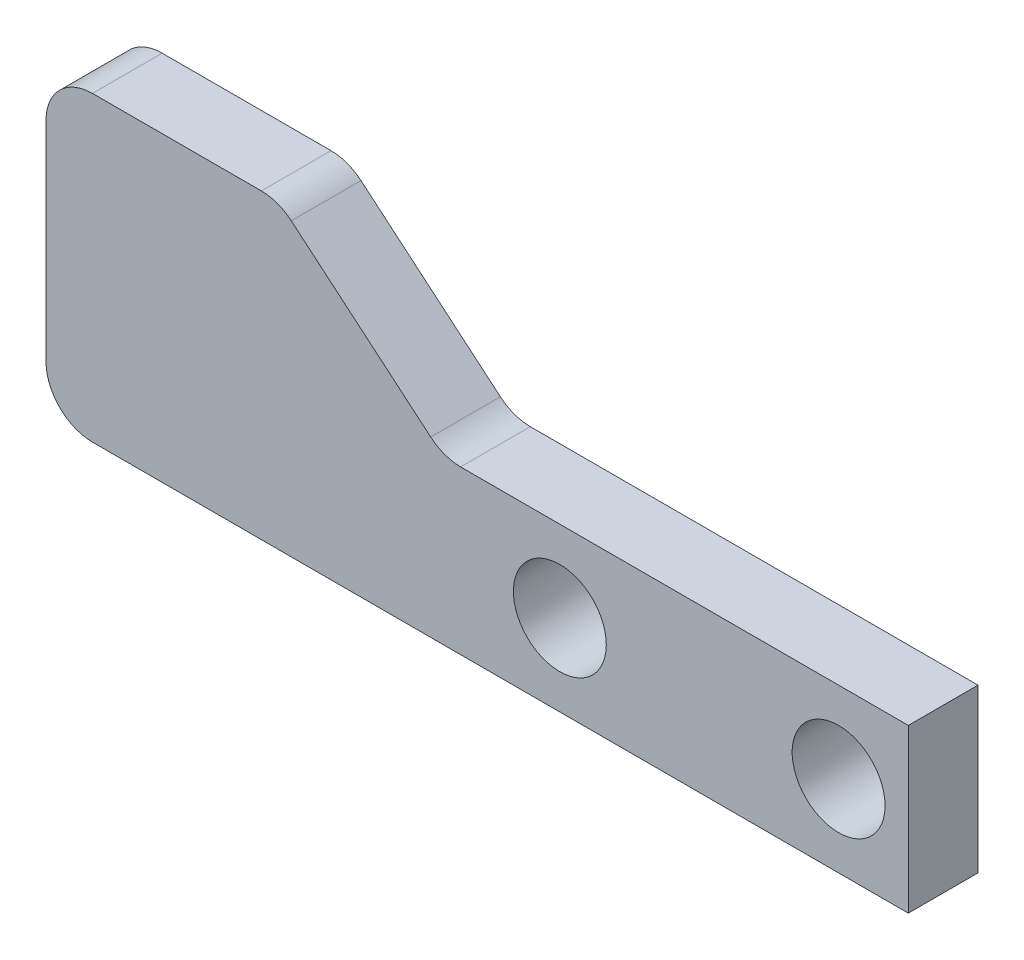
ISO-10303-21;
HEADER;
FILE_DESCRIPTION(('STEP AP214'),'2;1');
FILE_NAME('part.step','',(''),(''),'','','');
FILE_SCHEMA(('AUTOMOTIVE_DESIGN { 1 0 10303 214 1 1 1 1 }'));
ENDSEC;
DATA;
#1=APPLICATION_CONTEXT('core data for automotive mechanical design processes');
#2=APPLICATION_PROTOCOL_DEFINITION('international standard','automotive_design',2000,#1);
#3=PRODUCT_CONTEXT('',#1,'mechanical');
#4=PRODUCT('Part','Part','',(#3));
#5=PRODUCT_RELATED_PRODUCT_CATEGORY('part','',(#4));
#6=PRODUCT_DEFINITION_FORMATION('','',#4);
#7=PRODUCT_DEFINITION_CONTEXT('part definition',#1,'design');
#8=PRODUCT_DEFINITION('design','',#6,#7);
#9=PRODUCT_DEFINITION_SHAPE('','',#8);
#10=(LENGTH_UNIT() NAMED_UNIT(*) SI_UNIT(.MILLI.,.METRE.));
#11=(NAMED_UNIT(*) PLANE_ANGLE_UNIT() SI_UNIT($,.RADIAN.));
#12=(NAMED_UNIT(*) SI_UNIT($,.STERADIAN.) SOLID_ANGLE_UNIT());
#13=UNCERTAINTY_MEASURE_WITH_UNIT(LENGTH_MEASURE(1.E-05),#10,'distance_accuracy_value','');
#14=(GEOMETRIC_REPRESENTATION_CONTEXT(3) GLOBAL_UNCERTAINTY_ASSIGNED_CONTEXT((#13)) GLOBAL_UNIT_ASSIGNED_CONTEXT((#10,
#11,#12)) REPRESENTATION_CONTEXT('',''));
#15=CARTESIAN_POINT('',(0.,0.,0.));
#16=DIRECTION('',(0.,0.,1.));
#17=DIRECTION('',(1.,0.,0.));
#18=AXIS2_PLACEMENT_3D('',#15,#16,#17);
#19=CARTESIAN_POINT('',(-10.2694452488353,5.5,1.5));
#20=DIRECTION('',(0.,0.,-1.));
#21=DIRECTION('',(-1.,0.,0.));
#22=AXIS2_PLACEMENT_3D('',#19,#20,#21);
#23=PLANE('',#22);
#24=CARTESIAN_POINT('',(-6.,0.,1.5));
#25=DIRECTION('',(0.,0.,1.));
#26=DIRECTION('',(1.,0.,0.));
#27=AXIS2_PLACEMENT_3D('',#24,#25,#26);
#28=CIRCLE('',#27,2.);
#29=CARTESIAN_POINT('',(-4.,0.,1.5));
#30=VERTEX_POINT('',#29);
#31=EDGE_CURVE('E147',#30,#30,#28,.T.);
#32=ORIENTED_EDGE('',*,*,#31,.F.);
#33=EDGE_LOOP('',(#32));
#34=FACE_BOUND('',#33,.T.);
#35=DIRECTION('',(0.,1.,0.));
#36=VECTOR('',#35,1.);
#37=CARTESIAN_POINT('',(9.,-3.5,1.5));
#38=LINE('',#37,#36);
#39=CARTESIAN_POINT('',(9.,-3.5,1.5));
#40=VERTEX_POINT('',#39);
#41=CARTESIAN_POINT('',(9.,3.5,1.5));
#42=VERTEX_POINT('',#41);
#43=EDGE_CURVE('E163',#40,#42,#38,.T.);
#44=ORIENTED_EDGE('',*,*,#43,.T.);
#45=DIRECTION('',(-1.,0.,0.));
#46=VECTOR('',#45,1.);
#47=CARTESIAN_POINT('',(-9.,3.5,1.5));
#48=LINE('',#47,#46);
#49=CARTESIAN_POINT('',(-10.2694452488353,3.5,1.5));
#50=VERTEX_POINT('',#49);
#51=EDGE_CURVE('E97',#42,#50,#48,.T.);
#52=ORIENTED_EDGE('',*,*,#51,.T.);
#53=CARTESIAN_POINT('',(-10.2694452488353,5.5,1.5));
#54=DIRECTION('',(0.,0.,-1.));
#55=DIRECTION('',(-1.,0.,0.));
#56=AXIS2_PLACEMENT_3D('',#53,#54,#55);
#57=CIRCLE('',#56,2.);
#58=CARTESIAN_POINT('',(-11.5585523364515,3.97088165380907,1.5));
#59=VERTEX_POINT('',#58);
#60=EDGE_CURVE('E184',#50,#59,#57,.T.);
#61=ORIENTED_EDGE('',*,*,#60,.T.);
#62=DIRECTION('',(-0.764559173095464,0.6445535438081,0.));
#63=VECTOR('',#62,1.);
#64=CARTESIAN_POINT('',(-11.5585523364515,3.97088165380908,1.5));
#65=LINE('',#64,#63);
#66=CARTESIAN_POINT('',(-17.5585523364515,9.02911834619092,1.5));
#67=VERTEX_POINT('',#66);
#68=EDGE_CURVE('E201',#59,#67,#65,.T.);
#69=ORIENTED_EDGE('',*,*,#68,.T.);
#70=CARTESIAN_POINT('',(-18.8476594240677,7.5,1.5));
#71=DIRECTION('',(0.,0.,1.));
#72=DIRECTION('',(-1.,0.,0.));
#73=AXIS2_PLACEMENT_3D('',#70,#71,#72);
#74=CIRCLE('',#73,2.);
#75=CARTESIAN_POINT('',(-18.8476594240677,9.5,1.5));
#76=VERTEX_POINT('',#75);
#77=EDGE_CURVE('E198',#67,#76,#74,.T.);
#78=ORIENTED_EDGE('',*,*,#77,.T.);
#79=DIRECTION('',(-1.,0.,0.));
#80=VECTOR('',#79,1.);
#81=CARTESIAN_POINT('',(-18.8476594240677,9.5,1.5));
#82=LINE('',#81,#80);
#83=CARTESIAN_POINT('',(-26.117104672903,9.5,1.5));
#84=VERTEX_POINT('',#83);
#85=EDGE_CURVE('E200',#76,#84,#82,.T.);
#86=ORIENTED_EDGE('',*,*,#85,.T.);
#87=CARTESIAN_POINT('',(-26.117104672903,7.5,1.5));
#88=DIRECTION('',(0.,0.,1.));
#89=DIRECTION('',(-1.,0.,0.));
#90=AXIS2_PLACEMENT_3D('',#87,#88,#89);
#91=CIRCLE('',#90,2.);
#92=CARTESIAN_POINT('',(-28.117104672903,7.5,1.5));
#93=VERTEX_POINT('',#92);
#94=EDGE_CURVE('E123',#84,#93,#91,.T.);
#95=ORIENTED_EDGE('',*,*,#94,.T.);
#96=DIRECTION('',(0.,-1.,0.));
#97=VECTOR('',#96,1.);
#98=CARTESIAN_POINT('',(-28.117104672903,7.5,1.5));
#99=LINE('',#98,#97);
#100=CARTESIAN_POINT('',(-28.117104672903,-1.5,1.5));
#101=VERTEX_POINT('',#100);
#102=EDGE_CURVE('E116',#93,#101,#99,.T.);
#103=ORIENTED_EDGE('',*,*,#102,.T.);
#104=CARTESIAN_POINT('',(-26.117104672903,-1.5,1.5));
#105=DIRECTION('',(0.,0.,1.));
#106=DIRECTION('',(-1.,0.,0.));
#107=AXIS2_PLACEMENT_3D('',#104,#105,#106);
#108=CIRCLE('',#107,2.);
#109=CARTESIAN_POINT('',(-26.117104672903,-3.5,1.5));
#110=VERTEX_POINT('',#109);
#111=EDGE_CURVE('E120',#101,#110,#108,.T.);
#112=ORIENTED_EDGE('',*,*,#111,.T.);
#113=DIRECTION('',(1.,0.,0.));
#114=VECTOR('',#113,1.);
#115=CARTESIAN_POINT('',(-26.117104672903,-3.5,1.5));
#116=LINE('',#115,#114);
#117=EDGE_CURVE('E50',#110,#40,#116,.T.);
#118=ORIENTED_EDGE('',*,*,#117,.T.);
#119=EDGE_LOOP('',(#44,#52,#61,#69,#78,#86,#95,#103,#112,#118));
#120=FACE_BOUND('',#119,.T.);
#121=CARTESIAN_POINT('',(6.,0.,1.5));
#122=DIRECTION('',(0.,0.,1.));
#123=DIRECTION('',(1.,0.,0.));
#124=AXIS2_PLACEMENT_3D('',#121,#122,#123);
#125=CIRCLE('',#124,2.);
#126=CARTESIAN_POINT('',(8.,0.,1.5));
#127=VERTEX_POINT('',#126);
#128=EDGE_CURVE('E212',#127,#127,#125,.T.);
#129=ORIENTED_EDGE('',*,*,#128,.F.);
#130=EDGE_LOOP('',(#129));
#131=FACE_BOUND('',#130,.T.);
#132=ADVANCED_FACE('F33',(#34,#120,#131),#23,.F.);
#133=CARTESIAN_POINT('',(-10.2694452488353,5.5,-1.5));
#134=DIRECTION('',(0.,0.,-1.));
#135=DIRECTION('',(-1.,0.,0.));
#136=AXIS2_PLACEMENT_3D('',#133,#134,#135);
#137=PLANE('',#136);
#138=CARTESIAN_POINT('',(-6.,0.,-1.5));
#139=DIRECTION('',(0.,0.,1.));
#140=DIRECTION('',(1.,0.,0.));
#141=AXIS2_PLACEMENT_3D('',#138,#139,#140);
#142=CIRCLE('',#141,2.);
#143=CARTESIAN_POINT('',(-4.,0.,-1.5));
#144=VERTEX_POINT('',#143);
#145=EDGE_CURVE('E209',#144,#144,#142,.T.);
#146=ORIENTED_EDGE('',*,*,#145,.T.);
#147=EDGE_LOOP('',(#146));
#148=FACE_BOUND('',#147,.T.);
#149=DIRECTION('',(0.,1.,0.));
#150=VECTOR('',#149,1.);
#151=CARTESIAN_POINT('',(9.,-3.5,-1.5));
#152=LINE('',#151,#150);
#153=CARTESIAN_POINT('',(9.,-3.5,-1.5));
#154=VERTEX_POINT('',#153);
#155=CARTESIAN_POINT('',(9.,3.5,-1.5));
#156=VERTEX_POINT('',#155);
#157=EDGE_CURVE('E143',#154,#156,#152,.T.);
#158=ORIENTED_EDGE('',*,*,#157,.F.);
#159=DIRECTION('',(1.,0.,0.));
#160=VECTOR('',#159,1.);
#161=CARTESIAN_POINT('',(-9.,-3.5,-1.5));
#162=LINE('',#161,#160);
#163=CARTESIAN_POINT('',(-26.117104672903,-3.5,-1.5));
#164=VERTEX_POINT('',#163);
#165=EDGE_CURVE('E85',#164,#154,#162,.T.);
#166=ORIENTED_EDGE('',*,*,#165,.F.);
#167=CARTESIAN_POINT('',(-26.117104672903,-1.5,-1.5));
#168=DIRECTION('',(0.,0.,1.));
#169=DIRECTION('',(-1.,0.,0.));
#170=AXIS2_PLACEMENT_3D('',#167,#168,#169);
#171=CIRCLE('',#170,2.);
#172=CARTESIAN_POINT('',(-28.117104672903,-1.5,-1.5));
#173=VERTEX_POINT('',#172);
#174=EDGE_CURVE('E160',#173,#164,#171,.T.);
#175=ORIENTED_EDGE('',*,*,#174,.F.);
#176=DIRECTION('',(0.,-1.,0.));
#177=VECTOR('',#176,1.);
#178=CARTESIAN_POINT('',(-28.117104672903,7.5,-1.5));
#179=LINE('',#178,#177);
#180=CARTESIAN_POINT('',(-28.117104672903,7.5,-1.5));
#181=VERTEX_POINT('',#180);
#182=EDGE_CURVE('E132',#181,#173,#179,.T.);
#183=ORIENTED_EDGE('',*,*,#182,.F.);
#184=CARTESIAN_POINT('',(-26.117104672903,7.5,-1.5));
#185=DIRECTION('',(0.,0.,1.));
#186=DIRECTION('',(-1.,0.,0.));
#187=AXIS2_PLACEMENT_3D('',#184,#185,#186);
#188=CIRCLE('',#187,2.);
#189=CARTESIAN_POINT('',(-26.117104672903,9.5,-1.5));
#190=VERTEX_POINT('',#189);
#191=EDGE_CURVE('E157',#190,#181,#188,.T.);
#192=ORIENTED_EDGE('',*,*,#191,.F.);
#193=DIRECTION('',(-1.,0.,0.));
#194=VECTOR('',#193,1.);
#195=CARTESIAN_POINT('',(-18.8476594240677,9.5,-1.5));
#196=LINE('',#195,#194);
#197=CARTESIAN_POINT('',(-18.8476594240677,9.5,-1.5));
#198=VERTEX_POINT('',#197);
#199=EDGE_CURVE('E155',#198,#190,#196,.T.);
#200=ORIENTED_EDGE('',*,*,#199,.F.);
#201=CARTESIAN_POINT('',(-18.8476594240677,7.5,-1.5));
#202=DIRECTION('',(0.,0.,1.));
#203=DIRECTION('',(-1.,0.,0.));
#204=AXIS2_PLACEMENT_3D('',#201,#202,#203);
#205=CIRCLE('',#204,2.);
#206=CARTESIAN_POINT('',(-17.5585523364515,9.02911834619092,-1.5));
#207=VERTEX_POINT('',#206);
#208=EDGE_CURVE('E153',#207,#198,#205,.T.);
#209=ORIENTED_EDGE('',*,*,#208,.F.);
#210=DIRECTION('',(-0.764559173095464,0.6445535438081,0.));
#211=VECTOR('',#210,1.);
#212=CARTESIAN_POINT('',(-11.5585523364515,3.97088165380908,-1.5));
#213=LINE('',#212,#211);
#214=CARTESIAN_POINT('',(-11.5585523364515,3.97088165380907,-1.5));
#215=VERTEX_POINT('',#214);
#216=EDGE_CURVE('E151',#215,#207,#213,.T.);
#217=ORIENTED_EDGE('',*,*,#216,.F.);
#218=CARTESIAN_POINT('',(-10.2694452488353,5.5,-1.5));
#219=DIRECTION('',(0.,0.,-1.));
#220=DIRECTION('',(-1.,0.,0.));
#221=AXIS2_PLACEMENT_3D('',#218,#219,#220);
#222=CIRCLE('',#221,2.);
#223=CARTESIAN_POINT('',(-10.2694452488353,3.5,-1.5));
#224=VERTEX_POINT('',#223);
#225=EDGE_CURVE('E149',#224,#215,#222,.T.);
#226=ORIENTED_EDGE('',*,*,#225,.F.);
#227=DIRECTION('',(-1.,0.,0.));
#228=VECTOR('',#227,1.);
#229=CARTESIAN_POINT('',(-9.,3.5,-1.5));
#230=LINE('',#229,#228);
#231=EDGE_CURVE('E146',#156,#224,#230,.T.);
#232=ORIENTED_EDGE('',*,*,#231,.F.);
#233=EDGE_LOOP('',(#158,#166,#175,#183,#192,#200,#209,#217,#226,#232));
#234=FACE_BOUND('',#233,.T.);
#235=CARTESIAN_POINT('',(6.,0.,-1.5));
#236=DIRECTION('',(0.,0.,1.));
#237=DIRECTION('',(1.,0.,0.));
#238=AXIS2_PLACEMENT_3D('',#235,#236,#237);
#239=CIRCLE('',#238,2.);
#240=CARTESIAN_POINT('',(8.,0.,-1.5));
#241=VERTEX_POINT('',#240);
#242=EDGE_CURVE('E215',#241,#241,#239,.T.);
#243=ORIENTED_EDGE('',*,*,#242,.T.);
#244=EDGE_LOOP('',(#243));
#245=FACE_BOUND('',#244,.T.);
#246=ADVANCED_FACE('F186',(#148,#234,#245),#137,.T.);
#247=CARTESIAN_POINT('',(9.,-3.5,1.5));
#248=DIRECTION('',(-1.,0.,0.));
#249=DIRECTION('',(0.,0.,1.));
#250=AXIS2_PLACEMENT_3D('',#247,#248,#249);
#251=PLANE('',#250);
#252=ORIENTED_EDGE('',*,*,#157,.T.);
#253=DIRECTION('',(0.,0.,-1.));
#254=VECTOR('',#253,1.);
#255=CARTESIAN_POINT('',(9.,3.5,1.5));
#256=LINE('',#255,#254);
#257=EDGE_CURVE('E11',#42,#156,#256,.T.);
#258=ORIENTED_EDGE('',*,*,#257,.F.);
#259=ORIENTED_EDGE('',*,*,#43,.F.);
#260=DIRECTION('',(0.,0.,-1.));
#261=VECTOR('',#260,1.);
#262=CARTESIAN_POINT('',(9.,-3.5,1.5));
#263=LINE('',#262,#261);
#264=EDGE_CURVE('E139',#40,#154,#263,.T.);
#265=ORIENTED_EDGE('',*,*,#264,.T.);
#266=EDGE_LOOP('',(#252,#258,#259,#265));
#267=FACE_BOUND('',#266,.T.);
#268=ADVANCED_FACE('F35',(#267),#251,.F.);
#269=CARTESIAN_POINT('',(-9.,3.5,1.5));
#270=DIRECTION('',(0.,-1.,0.));
#271=DIRECTION('',(0.,0.,-1.));
#272=AXIS2_PLACEMENT_3D('',#269,#270,#271);
#273=PLANE('',#272);
#274=ORIENTED_EDGE('',*,*,#231,.T.);
#275=DIRECTION('',(0.,0.,-1.));
#276=VECTOR('',#275,1.);
#277=CARTESIAN_POINT('',(-10.2694452488353,3.5,1.5));
#278=LINE('',#277,#276);
#279=EDGE_CURVE('E42',#50,#224,#278,.T.);
#280=ORIENTED_EDGE('',*,*,#279,.F.);
#281=ORIENTED_EDGE('',*,*,#51,.F.);
#282=ORIENTED_EDGE('',*,*,#257,.T.);
#283=EDGE_LOOP('',(#274,#280,#281,#282));
#284=FACE_BOUND('',#283,.T.);
#285=ADVANCED_FACE('F256',(#284),#273,.F.);
#286=CARTESIAN_POINT('',(-10.2694452488353,5.5,1.5));
#287=DIRECTION('',(0.,0.,-1.));
#288=DIRECTION('',(-1.,0.,0.));
#289=AXIS2_PLACEMENT_3D('',#286,#287,#288);
#290=CYLINDRICAL_SURFACE('',#289,2.);
#291=ORIENTED_EDGE('',*,*,#225,.T.);
#292=DIRECTION('',(0.,0.,-1.));
#293=VECTOR('',#292,1.);
#294=CARTESIAN_POINT('',(-11.5585523364515,3.97088165380907,1.5));
#295=LINE('',#294,#293);
#296=EDGE_CURVE('E176',#59,#215,#295,.T.);
#297=ORIENTED_EDGE('',*,*,#296,.F.);
#298=ORIENTED_EDGE('',*,*,#60,.F.);
#299=ORIENTED_EDGE('',*,*,#279,.T.);
#300=EDGE_LOOP('',(#291,#297,#298,#299));
#301=FACE_BOUND('',#300,.T.);
#302=ADVANCED_FACE('F182',(#301),#290,.F.);
#303=CARTESIAN_POINT('',(-11.5585523364515,3.97088165380908,1.5));
#304=DIRECTION('',(-0.6445535438081,-0.764559173095464,0.));
#305=DIRECTION('',(0.764559173095464,-0.6445535438081,0.));
#306=AXIS2_PLACEMENT_3D('',#303,#304,#305);
#307=PLANE('',#306);
#308=ORIENTED_EDGE('',*,*,#216,.T.);
#309=DIRECTION('',(0.,0.,-1.));
#310=VECTOR('',#309,1.);
#311=CARTESIAN_POINT('',(-17.5585523364515,9.02911834619092,1.5));
#312=LINE('',#311,#310);
#313=EDGE_CURVE('E173',#67,#207,#312,.T.);
#314=ORIENTED_EDGE('',*,*,#313,.F.);
#315=ORIENTED_EDGE('',*,*,#68,.F.);
#316=ORIENTED_EDGE('',*,*,#296,.T.);
#317=EDGE_LOOP('',(#308,#314,#315,#316));
#318=FACE_BOUND('',#317,.T.);
#319=ADVANCED_FACE('F192',(#318),#307,.F.);
#320=CARTESIAN_POINT('',(-18.8476594240677,7.5,1.5));
#321=DIRECTION('',(0.,0.,-1.));
#322=DIRECTION('',(-1.,0.,0.));
#323=AXIS2_PLACEMENT_3D('',#320,#321,#322);
#324=CYLINDRICAL_SURFACE('',#323,2.);
#325=ORIENTED_EDGE('',*,*,#208,.T.);
#326=DIRECTION('',(0.,0.,-1.));
#327=VECTOR('',#326,1.);
#328=CARTESIAN_POINT('',(-18.8476594240677,9.5,1.5));
#329=LINE('',#328,#327);
#330=EDGE_CURVE('E170',#76,#198,#329,.T.);
#331=ORIENTED_EDGE('',*,*,#330,.F.);
#332=ORIENTED_EDGE('',*,*,#77,.F.);
#333=ORIENTED_EDGE('',*,*,#313,.T.);
#334=EDGE_LOOP('',(#325,#331,#332,#333));
#335=FACE_BOUND('',#334,.T.);
#336=ADVANCED_FACE('F196',(#335),#324,.T.);
#337=CARTESIAN_POINT('',(-18.8476594240677,9.5,1.5));
#338=DIRECTION('',(0.,-1.,0.));
#339=DIRECTION('',(1.,0.,0.));
#340=AXIS2_PLACEMENT_3D('',#337,#338,#339);
#341=PLANE('',#340);
#342=ORIENTED_EDGE('',*,*,#199,.T.);
#343=DIRECTION('',(0.,0.,-1.));
#344=VECTOR('',#343,1.);
#345=CARTESIAN_POINT('',(-26.117104672903,9.5,1.5));
#346=LINE('',#345,#344);
#347=EDGE_CURVE('E167',#84,#190,#346,.T.);
#348=ORIENTED_EDGE('',*,*,#347,.F.);
#349=ORIENTED_EDGE('',*,*,#85,.F.);
#350=ORIENTED_EDGE('',*,*,#330,.T.);
#351=EDGE_LOOP('',(#342,#348,#349,#350));
#352=FACE_BOUND('',#351,.T.);
#353=ADVANCED_FACE('F246',(#352),#341,.F.);
#354=CARTESIAN_POINT('',(-26.117104672903,7.5,1.5));
#355=DIRECTION('',(0.,0.,-1.));
#356=DIRECTION('',(-1.,0.,0.));
#357=AXIS2_PLACEMENT_3D('',#354,#355,#356);
#358=CYLINDRICAL_SURFACE('',#357,2.);
#359=ORIENTED_EDGE('',*,*,#191,.T.);
#360=DIRECTION('',(0.,0.,-1.));
#361=VECTOR('',#360,1.);
#362=CARTESIAN_POINT('',(-28.117104672903,7.5,1.5));
#363=LINE('',#362,#361);
#364=EDGE_CURVE('E134',#93,#181,#363,.T.);
#365=ORIENTED_EDGE('',*,*,#364,.F.);
#366=ORIENTED_EDGE('',*,*,#94,.F.);
#367=ORIENTED_EDGE('',*,*,#347,.T.);
#368=EDGE_LOOP('',(#359,#365,#366,#367));
#369=FACE_BOUND('',#368,.T.);
#370=ADVANCED_FACE('F243',(#369),#358,.T.);
#371=CARTESIAN_POINT('',(-28.117104672903,7.5,1.5));
#372=DIRECTION('',(1.,0.,0.));
#373=DIRECTION('',(0.,0.,-1.));
#374=AXIS2_PLACEMENT_3D('',#371,#372,#373);
#375=PLANE('',#374);
#376=ORIENTED_EDGE('',*,*,#182,.T.);
#377=DIRECTION('',(0.,0.,-1.));
#378=VECTOR('',#377,1.);
#379=CARTESIAN_POINT('',(-28.117104672903,-1.5,1.5));
#380=LINE('',#379,#378);
#381=EDGE_CURVE('E129',#101,#173,#380,.T.);
#382=ORIENTED_EDGE('',*,*,#381,.F.);
#383=ORIENTED_EDGE('',*,*,#102,.F.);
#384=ORIENTED_EDGE('',*,*,#364,.T.);
#385=EDGE_LOOP('',(#376,#382,#383,#384));
#386=FACE_BOUND('',#385,.T.);
#387=ADVANCED_FACE('F130',(#386),#375,.F.);
#388=CARTESIAN_POINT('',(-26.117104672903,-1.5,1.5));
#389=DIRECTION('',(0.,0.,-1.));
#390=DIRECTION('',(-1.,0.,0.));
#391=AXIS2_PLACEMENT_3D('',#388,#389,#390);
#392=CYLINDRICAL_SURFACE('',#391,2.);
#393=ORIENTED_EDGE('',*,*,#174,.T.);
#394=DIRECTION('',(0.,0.,-1.));
#395=VECTOR('',#394,1.);
#396=CARTESIAN_POINT('',(-26.117104672903,-3.5,1.5));
#397=LINE('',#396,#395);
#398=EDGE_CURVE('E135',#110,#164,#397,.T.);
#399=ORIENTED_EDGE('',*,*,#398,.F.);
#400=ORIENTED_EDGE('',*,*,#111,.F.);
#401=ORIENTED_EDGE('',*,*,#381,.T.);
#402=EDGE_LOOP('',(#393,#399,#400,#401));
#403=FACE_BOUND('',#402,.T.);
#404=ADVANCED_FACE('F137',(#403),#392,.T.);
#405=CARTESIAN_POINT('',(-9.,-3.5,1.5));
#406=DIRECTION('',(0.,1.,0.));
#407=DIRECTION('',(0.,0.,1.));
#408=AXIS2_PLACEMENT_3D('',#405,#406,#407);
#409=PLANE('',#408);
#410=ORIENTED_EDGE('',*,*,#165,.T.);
#411=ORIENTED_EDGE('',*,*,#264,.F.);
#412=ORIENTED_EDGE('',*,*,#117,.F.);
#413=ORIENTED_EDGE('',*,*,#398,.T.);
#414=EDGE_LOOP('',(#410,#411,#412,#413));
#415=FACE_BOUND('',#414,.T.);
#416=ADVANCED_FACE('F236',(#415),#409,.F.);
#417=CARTESIAN_POINT('',(-6.,0.,1.5));
#418=DIRECTION('',(0.,0.,-1.));
#419=DIRECTION('',(-1.,0.,0.));
#420=AXIS2_PLACEMENT_3D('',#417,#418,#419);
#421=CYLINDRICAL_SURFACE('',#420,2.);
#422=ORIENTED_EDGE('',*,*,#31,.T.);
#423=EDGE_LOOP('',(#422));
#424=FACE_BOUND('',#423,.T.);
#425=ORIENTED_EDGE('',*,*,#145,.F.);
#426=EDGE_LOOP('',(#425));
#427=FACE_BOUND('',#426,.T.);
#428=ADVANCED_FACE('F233',(#424,#427),#421,.F.);
#429=CARTESIAN_POINT('',(6.,0.,1.5));
#430=DIRECTION('',(0.,0.,-1.));
#431=DIRECTION('',(-1.,0.,0.));
#432=AXIS2_PLACEMENT_3D('',#429,#430,#431);
#433=CYLINDRICAL_SURFACE('',#432,2.);
#434=ORIENTED_EDGE('',*,*,#128,.T.);
#435=EDGE_LOOP('',(#434));
#436=FACE_BOUND('',#435,.T.);
#437=ORIENTED_EDGE('',*,*,#242,.F.);
#438=EDGE_LOOP('',(#437));
#439=FACE_BOUND('',#438,.T.);
#440=ADVANCED_FACE('F221',(#436,#439),#433,.F.);
#441=CLOSED_SHELL('',(#132,#246,#268,#285,#302,#319,#336,#353,#370,#387,#404,#416,#428,#440));
#442=MANIFOLD_SOLID_BREP('B2',#441);
#443=ADVANCED_BREP_SHAPE_REPRESENTATION('',(#18,#442),#14);
#444=SHAPE_DEFINITION_REPRESENTATION(#9,#443);
ENDSEC;
END-ISO-10303-21;
